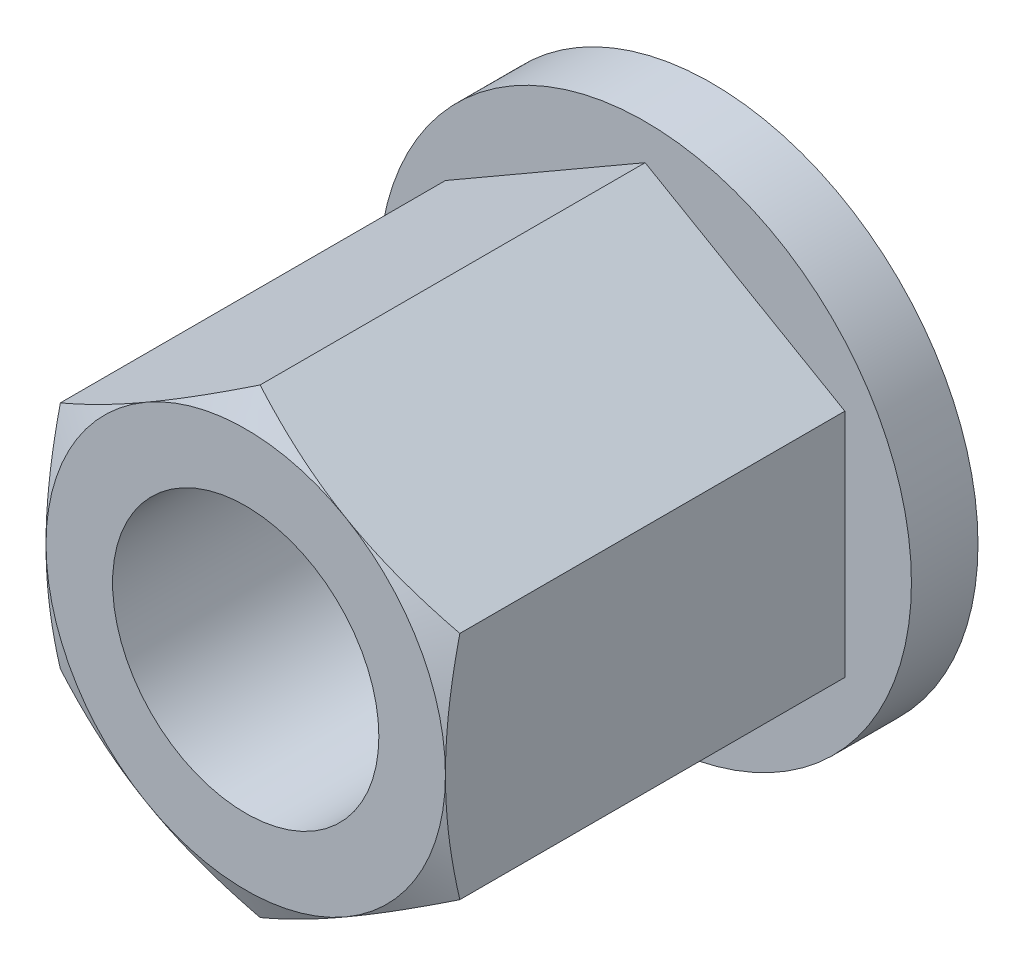
ISO-10303-21;
HEADER;
FILE_DESCRIPTION(('STEP AP214'),'2;1');
FILE_NAME('part.step','',(''),(''),'','','');
FILE_SCHEMA(('AUTOMOTIVE_DESIGN { 1 0 10303 214 1 1 1 1 }'));
ENDSEC;
DATA;
#1=APPLICATION_CONTEXT('core data for automotive mechanical design processes');
#2=APPLICATION_PROTOCOL_DEFINITION('international standard','automotive_design',2000,#1);
#3=PRODUCT_CONTEXT('',#1,'mechanical');
#4=PRODUCT('Part','Part','',(#3));
#5=PRODUCT_RELATED_PRODUCT_CATEGORY('part','',(#4));
#6=PRODUCT_DEFINITION_FORMATION('','',#4);
#7=PRODUCT_DEFINITION_CONTEXT('part definition',#1,'design');
#8=PRODUCT_DEFINITION('design','',#6,#7);
#9=PRODUCT_DEFINITION_SHAPE('','',#8);
#10=(LENGTH_UNIT() NAMED_UNIT(*) SI_UNIT(.MILLI.,.METRE.));
#11=(NAMED_UNIT(*) PLANE_ANGLE_UNIT() SI_UNIT($,.RADIAN.));
#12=(NAMED_UNIT(*) SI_UNIT($,.STERADIAN.) SOLID_ANGLE_UNIT());
#13=UNCERTAINTY_MEASURE_WITH_UNIT(LENGTH_MEASURE(1.E-05),#10,'distance_accuracy_value','');
#14=(GEOMETRIC_REPRESENTATION_CONTEXT(3) GLOBAL_UNCERTAINTY_ASSIGNED_CONTEXT((#13)) GLOBAL_UNIT_ASSIGNED_CONTEXT((#10,
#11,#12)) REPRESENTATION_CONTEXT('',''));
#15=CARTESIAN_POINT('',(0.,0.,0.));
#16=DIRECTION('',(0.,0.,1.));
#17=DIRECTION('',(1.,0.,0.));
#18=AXIS2_PLACEMENT_3D('',#15,#16,#17);
#19=CARTESIAN_POINT('',(0.,0.,34.5971502451229));
#20=DIRECTION('',(0.,0.,1.));
#21=DIRECTION('',(1.,0.,0.));
#22=AXIS2_PLACEMENT_3D('',#19,#20,#21);
#23=CYLINDRICAL_SURFACE('',#22,12.7);
#24=CARTESIAN_POINT('',(0.,0.,0.));
#25=DIRECTION('',(0.,0.,1.));
#26=DIRECTION('',(1.,0.,0.));
#27=AXIS2_PLACEMENT_3D('',#24,#25,#26);
#28=CIRCLE('',#27,12.7);
#29=CARTESIAN_POINT('',(12.7,0.,0.));
#30=VERTEX_POINT('',#29);
#31=EDGE_CURVE('E12',#30,#30,#28,.T.);
#32=ORIENTED_EDGE('',*,*,#31,.T.);
#33=EDGE_LOOP('',(#32));
#34=FACE_BOUND('',#33,.T.);
#35=CARTESIAN_POINT('',(0.,0.,3.175));
#36=DIRECTION('',(0.,0.,1.));
#37=DIRECTION('',(1.,0.,0.));
#38=AXIS2_PLACEMENT_3D('',#35,#36,#37);
#39=CIRCLE('',#38,12.7);
#40=CARTESIAN_POINT('',(12.7,0.,3.175));
#41=VERTEX_POINT('',#40);
#42=EDGE_CURVE('E39',#41,#41,#39,.T.);
#43=ORIENTED_EDGE('',*,*,#42,.F.);
#44=EDGE_LOOP('',(#43));
#45=FACE_BOUND('',#44,.T.);
#46=ADVANCED_FACE('F35',(#34,#45),#23,.T.);
#47=CARTESIAN_POINT('',(0.,0.,20.7444731853579));
#48=DIRECTION('',(0.,0.,-1.));
#49=DIRECTION('',(-1.,0.,0.));
#50=AXIS2_PLACEMENT_3D('',#47,#48,#49);
#51=CONICAL_SURFACE('',#50,12.7,1.13446401379632);
#52=CARTESIAN_POINT('',(-9.5252,-5.49914584397735,21.5378312686515));
#53=CARTESIAN_POINT('',(-9.23714774966446,-5.66545288824925,21.6153803198663));
#54=CARTESIAN_POINT('',(-8.94803264224347,-5.83237357334555,21.6879491868909));
#55=CARTESIAN_POINT('',(-8.36763285827653,-6.16746754485646,21.8213979318043));
#56=CARTESIAN_POINT('',(-8.07634709596202,-6.33564145813985,21.8822714859345));
#57=CARTESIAN_POINT('',(-7.49159935291989,-6.67324572499325,21.9905642276981));
#58=CARTESIAN_POINT('',(-7.19813558968586,-6.84267710769382,22.0379707623878));
#59=CARTESIAN_POINT('',(-6.6097036053371,-7.18240847225736,22.1175795674055));
#60=CARTESIAN_POINT('',(-6.31473567657497,-7.35270828533048,22.1497846863926));
#61=CARTESIAN_POINT('',(-5.72991174563497,-7.69035653928723,22.1972116585363));
#62=CARTESIAN_POINT('',(-5.44007656078522,-7.85769296128085,22.2127718014524));
#63=CARTESIAN_POINT('',(-4.8600719533166,-8.19255877753408,22.2274284110199));
#64=CARTESIAN_POINT('',(-4.56990251182178,-8.36008818269172,22.226523897209));
#65=CARTESIAN_POINT('',(-3.99022789296252,-8.69476347993251,22.2082967725173));
#66=CARTESIAN_POINT('',(-3.7007223485692,-8.86190958391988,22.1909894618081));
#67=CARTESIAN_POINT('',(-3.12276914422822,-9.19559102202515,22.1407018766246));
#68=CARTESIAN_POINT('',(-2.83432139045011,-9.36212641031609,22.1077230279152));
#69=CARTESIAN_POINT('',(-2.33329045725981,-9.65139675446584,22.0377395877518));
#70=CARTESIAN_POINT('',(-2.12035995791229,-9.77433223558281,22.0039761901903));
#71=CARTESIAN_POINT('',(-1.69547232667897,-10.0196412238507,21.9291583302494));
#72=CARTESIAN_POINT('',(-1.48351515466188,-10.1420147541715,21.8881041712953));
#73=CARTESIAN_POINT('',(-1.05893664165787,-10.3871452729464,21.7990179335116));
#74=CARTESIAN_POINT('',(-0.846323840389233,-10.5098973309921,21.7509319975265));
#75=CARTESIAN_POINT('',(-0.422222395200816,-10.7547524145353,21.6487315414084));
#76=CARTESIAN_POINT('',(-0.210733569249089,-10.8768555451291,21.5946180306942));
#77=CARTESIAN_POINT('',(0.000199999999999225,-10.9986380981162,21.5378312686515));
#78=B_SPLINE_CURVE_WITH_KNOTS('',3,(#52,#53,#54,#55,#56,#57,#58,#59,#60,#61,#62,#63,#64,#65,#66,
#67,#68,#69,#70,#71,#72,#73,#74,#75,#76,#77),.UNSPECIFIED.,.F.,.F.,(4,2,2,2,2,2,2,2,2,2,2,2,4),
(0.,1.02466245015782,2.04987739458362,3.07605241814589,4.10203506589353,5.10674474902197,
6.11151426231836,7.11534746997679,8.1190893683952,8.86351554085905,9.60791073919979,
10.3583390253194,11.1086418279986),.UNSPECIFIED.);
#79=CARTESIAN_POINT('',(-4.7625,-8.24889197104678,22.225));
#80=VERTEX_POINT('',#79);
#81=CARTESIAN_POINT('',(0.,-10.9985226280624,21.5378851140698));
#82=VERTEX_POINT('',#81);
#83=EDGE_CURVE('E115',#80,#82,#78,.T.);
#84=ORIENTED_EDGE('',*,*,#83,.T.);
#85=CARTESIAN_POINT('',(-0.000200000000001772,-10.9986380981162,21.5378312686515));
#86=CARTESIAN_POINT('',(0.287852250335537,-10.8323310538443,21.6153803198663));
#87=CARTESIAN_POINT('',(0.576967357756533,-10.665410368748,21.6879491868909));
#88=CARTESIAN_POINT('',(1.15736714172347,-10.3303163972371,21.8213979318043));
#89=CARTESIAN_POINT('',(1.44865290403798,-10.1621424839537,21.8822714859345));
#90=CARTESIAN_POINT('',(2.03340064708011,-9.82453821710031,21.990564227698));
#91=CARTESIAN_POINT('',(2.32686441031414,-9.65510683439974,22.0379707623878));
#92=CARTESIAN_POINT('',(2.9152963946629,-9.3153754698362,22.1175795674055));
#93=CARTESIAN_POINT('',(3.21026432342503,-9.14507565676308,22.1497846863926));
#94=CARTESIAN_POINT('',(3.79508825436503,-8.80742740280634,22.1972116585363));
#95=CARTESIAN_POINT('',(4.08492343921478,-8.64009098081271,22.2127718014524));
#96=CARTESIAN_POINT('',(4.6649280466834,-8.30522516455948,22.2274284110199));
#97=CARTESIAN_POINT('',(4.95509748817822,-8.13769575940184,22.226523897209));
#98=CARTESIAN_POINT('',(5.53477210703748,-7.80302046216105,22.2082967725173));
#99=CARTESIAN_POINT('',(5.8242776514308,-7.63587435817368,22.1909894618081));
#100=CARTESIAN_POINT('',(6.40223085577178,-7.30219292006841,22.1407018766246));
#101=CARTESIAN_POINT('',(6.69067860954989,-7.13565753177747,22.1077230279152));
#102=CARTESIAN_POINT('',(7.19170954274019,-6.84638718762772,22.0377395877518));
#103=CARTESIAN_POINT('',(7.40464004208771,-6.72345170651075,22.0039761901903));
#104=CARTESIAN_POINT('',(7.82952767332103,-6.47814271824285,21.9291583302494));
#105=CARTESIAN_POINT('',(8.04148484533813,-6.35576918792211,21.8881041712953));
#106=CARTESIAN_POINT('',(8.46606335834213,-6.11063866914712,21.7990179335116));
#107=CARTESIAN_POINT('',(8.67867615961077,-5.98788661110151,21.7509319975265));
#108=CARTESIAN_POINT('',(9.10277760479918,-5.74303152755827,21.6487315414084));
#109=CARTESIAN_POINT('',(9.31426643075091,-5.62092839696444,21.5946180306942));
#110=CARTESIAN_POINT('',(9.5252,-5.49914584397735,21.5378312686515));
#111=B_SPLINE_CURVE_WITH_KNOTS('',3,(#85,#86,#87,#88,#89,#90,#91,#92,#93,#94,#95,#96,#97,#98,
#99,#100,#101,#102,#103,#104,#105,#106,#107,#108,#109,#110),.UNSPECIFIED.,.F.,.F.,(4,2,2,2,2,2,
2,2,2,2,2,2,4),(0.,1.02466245015782,2.04987739458362,3.07605241814589,4.10203506589353,
5.10674474902197,6.11151426231836,7.11534746997679,8.1190893683952,8.86351554085905,
9.60791073919979,10.3583390253194,11.1086418279986),.UNSPECIFIED.);
#112=CARTESIAN_POINT('',(4.7625,-8.24889197104678,22.225));
#113=VERTEX_POINT('',#112);
#114=EDGE_CURVE('E241',#82,#113,#111,.T.);
#115=ORIENTED_EDGE('',*,*,#114,.T.);
#116=CARTESIAN_POINT('',(0.,0.,22.225));
#117=DIRECTION('',(0.,0.,1.));
#118=DIRECTION('',(1.,0.,0.));
#119=AXIS2_PLACEMENT_3D('',#116,#117,#118);
#120=CIRCLE('',#119,9.525);
#121=EDGE_CURVE('E254',#80,#113,#120,.T.);
#122=ORIENTED_EDGE('',*,*,#121,.F.);
#123=EDGE_LOOP('',(#84,#115,#122));
#124=FACE_BOUND('',#123,.T.);
#125=ADVANCED_FACE('F225',(#124),#51,.T.);
#126=CARTESIAN_POINT('',(9.525,0.,22.225));
#127=VERTEX_POINT('',#126);
#128=EDGE_CURVE('E248',#113,#127,#120,.T.);
#129=ORIENTED_EDGE('',*,*,#128,.F.);
#130=CARTESIAN_POINT('',(9.525,-5.49926131403119,21.5378851140698));
#131=VERTEX_POINT('',#130);
#132=EDGE_CURVE('E58',#113,#131,#111,.T.);
#133=ORIENTED_EDGE('',*,*,#132,.T.);
#134=CARTESIAN_POINT('',(9.525,-14.6714569370599,18.50983078932));
#135=CARTESIAN_POINT('',(9.525,-14.2424174047942,18.6775851744623));
#136=CARTESIAN_POINT('',(9.525,-13.8126576874129,18.8435313244609));
#137=CARTESIAN_POINT('',(9.525,-12.9513158035938,19.1707822644529));
#138=CARTESIAN_POINT('',(9.525,-12.5197334175996,19.3320864758727));
#139=CARTESIAN_POINT('',(9.525,-11.6530405020585,19.6495102046116));
#140=CARTESIAN_POINT('',(9.525,-11.2179230260299,19.8056108231762));
#141=CARTESIAN_POINT('',(9.525,-10.3451771820642,20.1106073489605));
#142=CARTESIAN_POINT('',(9.525,-9.90754890000271,20.2595035009666));
#143=CARTESIAN_POINT('',(9.525,-9.03504353010343,20.5463362866942));
#144=CARTESIAN_POINT('',(9.525,-8.6002054072028,20.6843908603759));
#145=CARTESIAN_POINT('',(9.525,-7.72709382701502,20.9493422722656));
#146=CARTESIAN_POINT('',(9.525,-7.28882019444548,21.076238537079));
#147=CARTESIAN_POINT('',(9.525,-6.4088121660482,21.3157940971686));
#148=CARTESIAN_POINT('',(9.525,-5.96708142698396,21.4284667165867));
#149=CARTESIAN_POINT('',(9.525,-5.07946799016646,21.636087566118));
#150=CARTESIAN_POINT('',(9.525,-4.6335858722676,21.7310382337242));
#151=CARTESIAN_POINT('',(9.525,-3.87954872279798,21.8724923478141));
#152=CARTESIAN_POINT('',(9.525,-3.57248614652507,21.9248164598931));
#153=CARTESIAN_POINT('',(9.525,-2.95660481466688,22.0179278182104));
#154=CARTESIAN_POINT('',(9.525,-2.6477861012117,22.0587153400327));
#155=CARTESIAN_POINT('',(9.525,-2.0288697566782,22.1275190998868));
#156=CARTESIAN_POINT('',(9.525,-1.71877283100044,22.1555416229303));
#157=CARTESIAN_POINT('',(9.525,-1.09763776975511,22.1979009742562));
#158=CARTESIAN_POINT('',(9.525,-0.786599642628748,22.2122379249154));
#159=CARTESIAN_POINT('',(9.525,-0.162860480611296,22.2267357500623));
#160=CARTESIAN_POINT('',(9.525,0.149841985278238,22.2268358530368));
#161=CARTESIAN_POINT('',(9.525,0.774923078901315,22.2127035909321));
#162=CARTESIAN_POINT('',(9.525,1.0873017019732,22.1984710223272));
#163=CARTESIAN_POINT('',(9.525,1.71116358202713,22.1561916124892));
#164=CARTESIAN_POINT('',(9.525,2.0226466870113,22.1281425510385));
#165=CARTESIAN_POINT('',(9.525,2.64415591419359,22.0591862306253));
#166=CARTESIAN_POINT('',(9.525,2.95418208861889,22.0182794362033));
#167=CARTESIAN_POINT('',(9.525,3.68793596874556,21.9073823711353));
#168=CARTESIAN_POINT('',(9.525,4.11088425686182,21.832235981874));
#169=CARTESIAN_POINT('',(9.525,4.95312622290305,21.6635043684355));
#170=CARTESIAN_POINT('',(9.525,5.37241899468547,21.5699147009707));
#171=CARTESIAN_POINT('',(9.525,6.20774491540377,21.3675897029298));
#172=CARTESIAN_POINT('',(9.525,6.62377437106444,21.2588392678876));
#173=CARTESIAN_POINT('',(9.525,7.4524145883651,21.0292107806886));
#174=CARTESIAN_POINT('',(9.525,7.86502557614724,20.9083335378054));
#175=CARTESIAN_POINT('',(9.525,8.68964656901352,20.6561267487627));
#176=CARTESIAN_POINT('',(9.525,9.10163913864557,20.5247405289047));
#177=CARTESIAN_POINT('',(9.525,9.92302025343939,20.2540865151779));
#178=CARTESIAN_POINT('',(9.525,10.3324087694497,20.1148186332487));
#179=CARTESIAN_POINT('',(9.525,11.1487520880277,19.8300105121744));
#180=CARTESIAN_POINT('',(9.525,11.5557080439795,19.6844735676852));
#181=CARTESIAN_POINT('',(9.525,12.3677362582521,19.3882573969582));
#182=CARTESIAN_POINT('',(9.525,12.772808528375,19.2375782029884));
#183=CARTESIAN_POINT('',(9.525,13.583159289861,18.9313355144351));
#184=CARTESIAN_POINT('',(9.525,13.9884306838863,18.7757532752347));
#185=CARTESIAN_POINT('',(9.525,14.7976127079132,18.4610859861206));
#186=CARTESIAN_POINT('',(9.525,15.2015233259534,18.3020009055089));
#187=CARTESIAN_POINT('',(9.525,16.4116322435901,17.8203700961145));
#188=CARTESIAN_POINT('',(9.525,17.2161052661535,17.4934878426219));
#189=CARTESIAN_POINT('',(9.525,18.4149318106988,16.9992500760519));
#190=CARTESIAN_POINT('',(9.525,18.8105664942429,16.8349801035234));
#191=CARTESIAN_POINT('',(9.525,19.6011211109873,16.5047254066563));
#192=CARTESIAN_POINT('',(9.525,19.9960410432742,16.3387406801283));
#193=CARTESIAN_POINT('',(9.525,20.7851711928324,16.0053444199197));
#194=CARTESIAN_POINT('',(9.525,21.1793815515204,15.8379332205521));
#195=CARTESIAN_POINT('',(9.525,21.9672568485612,15.5018384379186));
#196=CARTESIAN_POINT('',(9.525,22.3609217901359,15.3331548622072));
#197=CARTESIAN_POINT('',(9.525,22.7543533326489,15.1639300071672));
#198=B_SPLINE_CURVE_WITH_KNOTS('',3,(#134,#135,#136,#137,#138,#139,#140,#141,#142,#143,#144,
#145,#146,#147,#148,#149,#150,#151,#152,#153,#154,#155,#156,#157,#158,#159,#160,#161,#162,#163,
#164,#165,#166,#167,#168,#169,#170,#171,#172,#173,#174,#175,#176,#177,#178,#179,#180,#181,#182,
#183,#184,#185,#186,#187,#188,#189,#190,#191,#192,#193,#194,#195,#196,#197),.UNSPECIFIED.,.F.,
.F.,(4,2,2,2,2,2,2,2,2,2,2,2,2,2,2,2,2,2,2,2,2,2,2,2,2,2,2,2,2,2,2,4),(0.,1.38202297976087,
2.76421747596394,4.15098043688905,5.53769624660605,6.90626133303064,8.27489670518184,
9.64224032760618,11.0093957455571,11.9436756583985,12.8779332514394,13.8117303521963,
14.7455191028346,15.6832937119123,16.6210816376841,17.5590203088606,18.4969250968949,
19.7851181534977,21.0736219371275,22.3634187376715,23.6531295217593,24.9503372547595,
26.2475594840866,27.5441080933552,28.8406485681794,30.1429561981004,31.4452752456751,
34.0502419118193,35.3353873841365,36.620534497543,37.9053882788676,39.1902344376194),.UNSPECIFIED.);
#199=EDGE_CURVE('E113',#131,#127,#198,.T.);
#200=ORIENTED_EDGE('',*,*,#199,.T.);
#201=EDGE_LOOP('',(#129,#133,#200));
#202=FACE_BOUND('',#201,.T.);
#203=ADVANCED_FACE('F234',(#202),#51,.T.);
#204=CARTESIAN_POINT('',(4.7625,8.24889197104678,22.225));
#205=VERTEX_POINT('',#204);
#206=EDGE_CURVE('E44',#127,#205,#120,.T.);
#207=ORIENTED_EDGE('',*,*,#206,.F.);
#208=CARTESIAN_POINT('',(9.525,5.49926131403119,21.5378851140698));
#209=VERTEX_POINT('',#208);
#210=EDGE_CURVE('E197',#127,#209,#198,.T.);
#211=ORIENTED_EDGE('',*,*,#210,.T.);
#212=CARTESIAN_POINT('',(9.5252,5.49914584397736,21.5378312686515));
#213=CARTESIAN_POINT('',(9.23714774966446,5.66545288824926,21.6153803198663));
#214=CARTESIAN_POINT('',(8.94803264224347,5.83237357334555,21.6879491868909));
#215=CARTESIAN_POINT('',(8.36763285827653,6.16746754485647,21.8213979318043));
#216=CARTESIAN_POINT('',(8.07634709596202,6.33564145813985,21.8822714859345));
#217=CARTESIAN_POINT('',(7.49159935291989,6.67324572499325,21.990564227698));
#218=CARTESIAN_POINT('',(7.19813558968586,6.84267710769382,22.0379707623878));
#219=CARTESIAN_POINT('',(6.6097036053371,7.18240847225736,22.1175795674055));
#220=CARTESIAN_POINT('',(6.31473567657497,7.35270828533049,22.1497846863926));
#221=CARTESIAN_POINT('',(5.72991174563497,7.69035653928723,22.1972116585363));
#222=CARTESIAN_POINT('',(5.44007656078522,7.85769296128086,22.2127718014524));
#223=CARTESIAN_POINT('',(4.8600719533166,8.19255877753409,22.2274284110199));
#224=CARTESIAN_POINT('',(4.56990251182178,8.36008818269173,22.226523897209));
#225=CARTESIAN_POINT('',(3.99022789296252,8.69476347993251,22.2082967725173));
#226=CARTESIAN_POINT('',(3.7007223485692,8.86190958391989,22.1909894618081));
#227=CARTESIAN_POINT('',(3.12276914422822,9.19559102202516,22.1407018766246));
#228=CARTESIAN_POINT('',(2.83432139045011,9.36212641031609,22.1077230279152));
#229=CARTESIAN_POINT('',(2.33329045725981,9.65139675446584,22.0377395877518));
#230=CARTESIAN_POINT('',(2.12035995791229,9.77433223558281,22.0039761901903));
#231=CARTESIAN_POINT('',(1.69547232667897,10.0196412238507,21.9291583302494));
#232=CARTESIAN_POINT('',(1.48351515466188,10.1420147541715,21.8881041712953));
#233=CARTESIAN_POINT('',(1.05893664165787,10.3871452729464,21.7990179335116));
#234=CARTESIAN_POINT('',(0.846323840389236,10.5098973309921,21.7509319975264));
#235=CARTESIAN_POINT('',(0.422222395200818,10.7547524145353,21.6487315414084));
#236=CARTESIAN_POINT('',(0.210733569249092,10.8768555451291,21.5946180306942));
#237=CARTESIAN_POINT('',(-0.000199999999996797,10.9986380981162,21.5378312686515));
#238=B_SPLINE_CURVE_WITH_KNOTS('',3,(#212,#213,#214,#215,#216,#217,#218,#219,#220,#221,#222,
#223,#224,#225,#226,#227,#228,#229,#230,#231,#232,#233,#234,#235,#236,#237),.UNSPECIFIED.,.F.,
.F.,(4,2,2,2,2,2,2,2,2,2,2,2,4),(0.,1.02466245015782,2.04987739458362,3.07605241814588,
4.10203506589353,5.10674474902196,6.11151426231835,7.11534746997679,8.11908936839519,
8.86351554085905,9.60791073919979,10.3583390253194,11.1086418279986),.UNSPECIFIED.);
#239=EDGE_CURVE('E196',#209,#205,#238,.T.);
#240=ORIENTED_EDGE('',*,*,#239,.T.);
#241=EDGE_LOOP('',(#207,#211,#240));
#242=FACE_BOUND('',#241,.T.);
#243=ADVANCED_FACE('F258',(#242),#51,.T.);
#244=CARTESIAN_POINT('',(-4.7625,8.24889197104678,22.225));
#245=VERTEX_POINT('',#244);
#246=EDGE_CURVE('E260',#205,#245,#120,.T.);
#247=ORIENTED_EDGE('',*,*,#246,.F.);
#248=CARTESIAN_POINT('',(0.,10.9985226280624,21.5378851140698));
#249=VERTEX_POINT('',#248);
#250=EDGE_CURVE('E190',#205,#249,#238,.T.);
#251=ORIENTED_EDGE('',*,*,#250,.T.);
#252=CARTESIAN_POINT('',(0.000200000000002469,10.9986380981162,21.5378312686515));
#253=CARTESIAN_POINT('',(-0.287852250335537,10.8323310538443,21.6153803198663));
#254=CARTESIAN_POINT('',(-0.576967357756532,10.665410368748,21.6879491868909));
#255=CARTESIAN_POINT('',(-1.15736714172347,10.3303163972371,21.8213979318043));
#256=CARTESIAN_POINT('',(-1.44865290403798,10.1621424839537,21.8822714859345));
#257=CARTESIAN_POINT('',(-2.03340064708011,9.82453821710031,21.990564227698));
#258=CARTESIAN_POINT('',(-2.32686441031414,9.65510683439975,22.0379707623878));
#259=CARTESIAN_POINT('',(-2.9152963946629,9.31537546983621,22.1175795674055));
#260=CARTESIAN_POINT('',(-3.21026432342503,9.14507565676308,22.1497846863926));
#261=CARTESIAN_POINT('',(-3.79508825436503,8.80742740280634,22.1972116585363));
#262=CARTESIAN_POINT('',(-4.08492343921478,8.64009098081271,22.2127718014524));
#263=CARTESIAN_POINT('',(-4.6649280466834,8.30522516455948,22.2274284110199));
#264=CARTESIAN_POINT('',(-4.95509748817822,8.13769575940184,22.226523897209));
#265=CARTESIAN_POINT('',(-5.53477210703748,7.80302046216106,22.2082967725173));
#266=CARTESIAN_POINT('',(-5.8242776514308,7.63587435817368,22.1909894618081));
#267=CARTESIAN_POINT('',(-6.40223085577178,7.30219292006841,22.1407018766246));
#268=CARTESIAN_POINT('',(-6.69067860954989,7.13565753177748,22.1077230279152));
#269=CARTESIAN_POINT('',(-7.19170954274019,6.84638718762773,22.0377395877518));
#270=CARTESIAN_POINT('',(-7.40464004208771,6.72345170651075,22.0039761901903));
#271=CARTESIAN_POINT('',(-7.82952767332103,6.47814271824285,21.9291583302494));
#272=CARTESIAN_POINT('',(-8.04148484533813,6.35576918792211,21.8881041712953));
#273=CARTESIAN_POINT('',(-8.46606335834214,6.11063866914712,21.7990179335116));
#274=CARTESIAN_POINT('',(-8.67867615961077,5.98788661110151,21.7509319975265));
#275=CARTESIAN_POINT('',(-9.10277760479919,5.74303152755827,21.6487315414084));
#276=CARTESIAN_POINT('',(-9.31426643075092,5.62092839696444,21.5946180306942));
#277=CARTESIAN_POINT('',(-9.52520000000001,5.49914584397735,21.5378312686515));
#278=B_SPLINE_CURVE_WITH_KNOTS('',3,(#252,#253,#254,#255,#256,#257,#258,#259,#260,#261,#262,
#263,#264,#265,#266,#267,#268,#269,#270,#271,#272,#273,#274,#275,#276,#277),.UNSPECIFIED.,.F.,
.F.,(4,2,2,2,2,2,2,2,2,2,2,2,4),(0.,1.02466245015782,2.04987739458362,3.07605241814589,
4.10203506589353,5.10674474902196,6.11151426231835,7.11534746997679,8.1190893683952,
8.86351554085905,9.6079107391998,10.3583390253194,11.1086418279986),.UNSPECIFIED.);
#279=EDGE_CURVE('E188',#249,#245,#278,.T.);
#280=ORIENTED_EDGE('',*,*,#279,.T.);
#281=EDGE_LOOP('',(#247,#251,#280));
#282=FACE_BOUND('',#281,.T.);
#283=ADVANCED_FACE('F278',(#282),#51,.T.);
#284=CARTESIAN_POINT('',(-9.525,0.,22.225));
#285=VERTEX_POINT('',#284);
#286=EDGE_CURVE('E261',#245,#285,#120,.T.);
#287=ORIENTED_EDGE('',*,*,#286,.F.);
#288=CARTESIAN_POINT('',(-9.525,5.49926131403119,21.5378851140698));
#289=VERTEX_POINT('',#288);
#290=EDGE_CURVE('E182',#245,#289,#278,.T.);
#291=ORIENTED_EDGE('',*,*,#290,.T.);
#292=CARTESIAN_POINT('',(-9.525,-14.6714569370598,18.50983078932));
#293=CARTESIAN_POINT('',(-9.525,-14.2424174047942,18.6775851744623));
#294=CARTESIAN_POINT('',(-9.525,-13.8126576874129,18.8435313244609));
#295=CARTESIAN_POINT('',(-9.525,-12.9513158035938,19.1707822644529));
#296=CARTESIAN_POINT('',(-9.525,-12.5197334175996,19.3320864758727));
#297=CARTESIAN_POINT('',(-9.525,-11.6530405020585,19.6495102046116));
#298=CARTESIAN_POINT('',(-9.525,-11.2179230260299,19.8056108231762));
#299=CARTESIAN_POINT('',(-9.525,-10.3451771820642,20.1106073489605));
#300=CARTESIAN_POINT('',(-9.525,-9.9075489000027,20.2595035009666));
#301=CARTESIAN_POINT('',(-9.525,-9.03504353010342,20.5463362866942));
#302=CARTESIAN_POINT('',(-9.525,-8.60020540720279,20.6843908603759));
#303=CARTESIAN_POINT('',(-9.525,-7.72709382701501,20.9493422722657));
#304=CARTESIAN_POINT('',(-9.525,-7.28882019444547,21.076238537079));
#305=CARTESIAN_POINT('',(-9.525,-6.40881216604819,21.3157940971686));
#306=CARTESIAN_POINT('',(-9.525,-5.96708142698395,21.4284667165867));
#307=CARTESIAN_POINT('',(-9.525,-5.07946799016646,21.636087566118));
#308=CARTESIAN_POINT('',(-9.525,-4.63358587226759,21.7310382337242));
#309=CARTESIAN_POINT('',(-9.525,-3.87954872279797,21.8724923478141));
#310=CARTESIAN_POINT('',(-9.525,-3.57248614652506,21.9248164598931));
#311=CARTESIAN_POINT('',(-9.525,-2.95660481466688,22.0179278182104));
#312=CARTESIAN_POINT('',(-9.525,-2.6477861012117,22.0587153400327));
#313=CARTESIAN_POINT('',(-9.525,-2.02886975667819,22.1275190998868));
#314=CARTESIAN_POINT('',(-9.525,-1.71877283100043,22.1555416229303));
#315=CARTESIAN_POINT('',(-9.525,-1.09763776975511,22.1979009742562));
#316=CARTESIAN_POINT('',(-9.525,-0.786599642628742,22.2122379249154));
#317=CARTESIAN_POINT('',(-9.525,-0.162860480611291,22.2267357500623));
#318=CARTESIAN_POINT('',(-9.525,0.149841985278243,22.2268358530368));
#319=CARTESIAN_POINT('',(-9.525,0.774923078901321,22.2127035909321));
#320=CARTESIAN_POINT('',(-9.525,1.0873017019732,22.1984710223272));
#321=CARTESIAN_POINT('',(-9.525,1.71116358202714,22.1561916124892));
#322=CARTESIAN_POINT('',(-9.525,2.02264668701131,22.1281425510385));
#323=CARTESIAN_POINT('',(-9.525,2.6441559141936,22.0591862306253));
#324=CARTESIAN_POINT('',(-9.525,2.9541820886189,22.0182794362033));
#325=CARTESIAN_POINT('',(-9.525,3.68793596874557,21.9073823711353));
#326=CARTESIAN_POINT('',(-9.525,4.11088425686183,21.832235981874));
#327=CARTESIAN_POINT('',(-9.525,4.95312622290306,21.6635043684355));
#328=CARTESIAN_POINT('',(-9.525,5.37241899468549,21.5699147009707));
#329=CARTESIAN_POINT('',(-9.525,6.20774491540378,21.3675897029298));
#330=CARTESIAN_POINT('',(-9.525,6.62377437106445,21.2588392678876));
#331=CARTESIAN_POINT('',(-9.525,7.45241458836511,21.0292107806886));
#332=CARTESIAN_POINT('',(-9.525,7.86502557614726,20.9083335378054));
#333=CARTESIAN_POINT('',(-9.525,8.68964656901354,20.6561267487627));
#334=CARTESIAN_POINT('',(-9.525,9.10163913864559,20.5247405289047));
#335=CARTESIAN_POINT('',(-9.525,9.92302025343941,20.2540865151779));
#336=CARTESIAN_POINT('',(-9.525,10.3324087694497,20.1148186332487));
#337=CARTESIAN_POINT('',(-9.525,11.1487520880277,19.8300105121744));
#338=CARTESIAN_POINT('',(-9.525,11.5557080439795,19.6844735676852));
#339=CARTESIAN_POINT('',(-9.525,12.3677362582521,19.3882573969582));
#340=CARTESIAN_POINT('',(-9.525,12.772808528375,19.2375782029884));
#341=CARTESIAN_POINT('',(-9.525,13.583159289861,18.9313355144351));
#342=CARTESIAN_POINT('',(-9.525,13.9884306838864,18.7757532752347));
#343=CARTESIAN_POINT('',(-9.525,14.7976127079132,18.4610859861206));
#344=CARTESIAN_POINT('',(-9.525,15.2015233259534,18.3020009055089));
#345=CARTESIAN_POINT('',(-9.525,16.4116322435901,17.8203700961145));
#346=CARTESIAN_POINT('',(-9.525,17.2161052661535,17.4934878426219));
#347=CARTESIAN_POINT('',(-9.525,18.4149318106988,16.9992500760519));
#348=CARTESIAN_POINT('',(-9.525,18.8105664942429,16.8349801035234));
#349=CARTESIAN_POINT('',(-9.525,19.6011211109873,16.5047254066563));
#350=CARTESIAN_POINT('',(-9.525,19.9960410432742,16.3387406801283));
#351=CARTESIAN_POINT('',(-9.525,20.7851711928324,16.0053444199197));
#352=CARTESIAN_POINT('',(-9.525,21.1793815515204,15.8379332205521));
#353=CARTESIAN_POINT('',(-9.525,21.9672568485612,15.5018384379186));
#354=CARTESIAN_POINT('',(-9.525,22.3609217901359,15.3331548622072));
#355=CARTESIAN_POINT('',(-9.525,22.7543533326489,15.1639300071672));
#356=B_SPLINE_CURVE_WITH_KNOTS('',3,(#292,#293,#294,#295,#296,#297,#298,#299,#300,#301,#302,
#303,#304,#305,#306,#307,#308,#309,#310,#311,#312,#313,#314,#315,#316,#317,#318,#319,#320,#321,
#322,#323,#324,#325,#326,#327,#328,#329,#330,#331,#332,#333,#334,#335,#336,#337,#338,#339,#340,
#341,#342,#343,#344,#345,#346,#347,#348,#349,#350,#351,#352,#353,#354,#355),.UNSPECIFIED.,.F.,
.F.,(4,2,2,2,2,2,2,2,2,2,2,2,2,2,2,2,2,2,2,2,2,2,2,2,2,2,2,2,2,2,2,4),(0.,1.38202297976087,
2.76421747596394,4.15098043688905,5.53769624660606,6.90626133303064,8.27489670518184,
9.64224032760618,11.0093957455571,11.9436756583985,12.8779332514394,13.8117303521963,
14.7455191028346,15.6832937119123,16.6210816376841,17.5590203088606,18.4969250968949,
19.7851181534977,21.0736219371275,22.3634187376715,23.6531295217593,24.9503372547595,
26.2475594840866,27.5441080933552,28.8406485681794,30.1429561981004,31.4452752456751,
34.0502419118192,35.3353873841365,36.6205344975429,37.9053882788675,39.1902344376194),.UNSPECIFIED.);
#357=EDGE_CURVE('E189',#289,#285,#356,.F.);
#358=ORIENTED_EDGE('',*,*,#357,.T.);
#359=EDGE_LOOP('',(#287,#291,#358));
#360=FACE_BOUND('',#359,.T.);
#361=ADVANCED_FACE('F226',(#360),#51,.T.);
#362=CARTESIAN_POINT('',(0.,12.7,0.));
#363=DIRECTION('',(0.,0.,1.));
#364=DIRECTION('',(1.,0.,0.));
#365=AXIS2_PLACEMENT_3D('',#362,#363,#364);
#366=PLANE('',#365);
#367=ORIENTED_EDGE('',*,*,#31,.F.);
#368=EDGE_LOOP('',(#367));
#369=FACE_BOUND('',#368,.T.);
#370=CARTESIAN_POINT('',(0.,0.,0.));
#371=DIRECTION('',(0.,0.,1.));
#372=DIRECTION('',(1.,0.,0.));
#373=AXIS2_PLACEMENT_3D('',#370,#371,#372);
#374=CIRCLE('',#373,6.35);
#375=CARTESIAN_POINT('',(6.35,0.,0.));
#376=VERTEX_POINT('',#375);
#377=EDGE_CURVE('E240',#376,#376,#374,.T.);
#378=ORIENTED_EDGE('',*,*,#377,.T.);
#379=EDGE_LOOP('',(#378));
#380=FACE_BOUND('',#379,.T.);
#381=ADVANCED_FACE('F37',(#369,#380),#366,.F.);
#382=EDGE_CURVE('E266',#285,#80,#120,.T.);
#383=ORIENTED_EDGE('',*,*,#382,.F.);
#384=CARTESIAN_POINT('',(-9.525,-5.49926131403118,21.5378851140698));
#385=VERTEX_POINT('',#384);
#386=EDGE_CURVE('E157',#285,#385,#356,.F.);
#387=ORIENTED_EDGE('',*,*,#386,.T.);
#388=EDGE_CURVE('E156',#385,#80,#78,.T.);
#389=ORIENTED_EDGE('',*,*,#388,.T.);
#390=EDGE_LOOP('',(#383,#387,#389));
#391=FACE_BOUND('',#390,.T.);
#392=ADVANCED_FACE('F163',(#391),#51,.T.);
#393=CARTESIAN_POINT('',(0.,9.525,22.225));
#394=DIRECTION('',(0.,0.,-1.));
#395=DIRECTION('',(-1.,0.,0.));
#396=AXIS2_PLACEMENT_3D('',#393,#394,#395);
#397=PLANE('',#396);
#398=CARTESIAN_POINT('',(0.,0.,22.225));
#399=DIRECTION('',(0.,0.,1.));
#400=DIRECTION('',(1.,0.,0.));
#401=AXIS2_PLACEMENT_3D('',#398,#399,#400);
#402=CIRCLE('',#401,6.35);
#403=CARTESIAN_POINT('',(6.35,0.,22.225));
#404=VERTEX_POINT('',#403);
#405=EDGE_CURVE('E243',#404,#404,#402,.T.);
#406=ORIENTED_EDGE('',*,*,#405,.F.);
#407=EDGE_LOOP('',(#406));
#408=FACE_BOUND('',#407,.T.);
#409=ORIENTED_EDGE('',*,*,#206,.T.);
#410=ORIENTED_EDGE('',*,*,#246,.T.);
#411=ORIENTED_EDGE('',*,*,#286,.T.);
#412=ORIENTED_EDGE('',*,*,#382,.T.);
#413=ORIENTED_EDGE('',*,*,#121,.T.);
#414=ORIENTED_EDGE('',*,*,#128,.T.);
#415=EDGE_LOOP('',(#409,#410,#411,#412,#413,#414));
#416=FACE_BOUND('',#415,.T.);
#417=ADVANCED_FACE('F217',(#408,#416),#397,.F.);
#418=CARTESIAN_POINT('',(0.,0.,34.5971502451229));
#419=DIRECTION('',(0.,0.,1.));
#420=DIRECTION('',(1.,0.,0.));
#421=AXIS2_PLACEMENT_3D('',#418,#419,#420);
#422=CYLINDRICAL_SURFACE('',#421,6.35);
#423=ORIENTED_EDGE('',*,*,#377,.F.);
#424=EDGE_LOOP('',(#423));
#425=FACE_BOUND('',#424,.T.);
#426=ORIENTED_EDGE('',*,*,#405,.T.);
#427=EDGE_LOOP('',(#426));
#428=FACE_BOUND('',#427,.T.);
#429=ADVANCED_FACE('F215',(#425,#428),#422,.F.);
#430=CARTESIAN_POINT('',(0.,0.,3.175));
#431=DIRECTION('',(0.,0.,1.));
#432=DIRECTION('',(1.,0.,0.));
#433=AXIS2_PLACEMENT_3D('',#430,#431,#432);
#434=PLANE('',#433);
#435=DIRECTION('',(0.866025403784439,0.5,0.));
#436=VECTOR('',#435,1.);
#437=CARTESIAN_POINT('',(0.,-10.9985226280624,3.175));
#438=LINE('',#437,#436);
#439=CARTESIAN_POINT('',(0.,-10.9985226280624,3.175));
#440=VERTEX_POINT('',#439);
#441=CARTESIAN_POINT('',(9.525,-5.49926131403119,3.175));
#442=VERTEX_POINT('',#441);
#443=EDGE_CURVE('E124',#440,#442,#438,.T.);
#444=ORIENTED_EDGE('',*,*,#443,.F.);
#445=DIRECTION('',(0.866025403784438,-0.5,0.));
#446=VECTOR('',#445,1.);
#447=CARTESIAN_POINT('',(-9.525,-5.49926131403118,3.175));
#448=LINE('',#447,#446);
#449=CARTESIAN_POINT('',(-9.525,-5.49926131403118,3.175));
#450=VERTEX_POINT('',#449);
#451=EDGE_CURVE('E139',#450,#440,#448,.T.);
#452=ORIENTED_EDGE('',*,*,#451,.F.);
#453=DIRECTION('',(0.,-1.,0.));
#454=VECTOR('',#453,1.);
#455=CARTESIAN_POINT('',(-9.525,5.49926131403119,3.175));
#456=LINE('',#455,#454);
#457=CARTESIAN_POINT('',(-9.525,5.49926131403119,3.175));
#458=VERTEX_POINT('',#457);
#459=EDGE_CURVE('E136',#458,#450,#456,.T.);
#460=ORIENTED_EDGE('',*,*,#459,.F.);
#461=DIRECTION('',(-0.866025403784439,-0.5,0.));
#462=VECTOR('',#461,1.);
#463=CARTESIAN_POINT('',(0.,10.9985226280624,3.175));
#464=LINE('',#463,#462);
#465=CARTESIAN_POINT('',(0.,10.9985226280624,3.175));
#466=VERTEX_POINT('',#465);
#467=EDGE_CURVE('E133',#466,#458,#464,.T.);
#468=ORIENTED_EDGE('',*,*,#467,.F.);
#469=DIRECTION('',(-0.866025403784439,0.5,0.));
#470=VECTOR('',#469,1.);
#471=CARTESIAN_POINT('',(9.525,5.49926131403119,3.175));
#472=LINE('',#471,#470);
#473=CARTESIAN_POINT('',(9.525,5.49926131403119,3.175));
#474=VERTEX_POINT('',#473);
#475=EDGE_CURVE('E127',#474,#466,#472,.T.);
#476=ORIENTED_EDGE('',*,*,#475,.F.);
#477=DIRECTION('',(0.,1.,0.));
#478=VECTOR('',#477,1.);
#479=CARTESIAN_POINT('',(9.525,-5.49926131403119,3.175));
#480=LINE('',#479,#478);
#481=EDGE_CURVE('E111',#442,#474,#480,.T.);
#482=ORIENTED_EDGE('',*,*,#481,.F.);
#483=EDGE_LOOP('',(#444,#452,#460,#468,#476,#482));
#484=FACE_BOUND('',#483,.T.);
#485=ORIENTED_EDGE('',*,*,#42,.T.);
#486=EDGE_LOOP('',(#485));
#487=FACE_BOUND('',#486,.T.);
#488=ADVANCED_FACE('F121',(#484,#487),#434,.T.);
#489=CARTESIAN_POINT('',(0.,-10.9985226280624,22.225));
#490=DIRECTION('',(-0.5,0.866025403784439,0.));
#491=DIRECTION('',(-0.866025403784439,-0.5,0.));
#492=AXIS2_PLACEMENT_3D('',#489,#490,#491);
#493=PLANE('',#492);
#494=DIRECTION('',(0.,0.,-1.));
#495=VECTOR('',#494,1.);
#496=CARTESIAN_POINT('',(0.,-10.9985226280624,22.225));
#497=LINE('',#496,#495);
#498=EDGE_CURVE('E51',#82,#440,#497,.T.);
#499=ORIENTED_EDGE('',*,*,#498,.T.);
#500=ORIENTED_EDGE('',*,*,#443,.T.);
#501=DIRECTION('',(0.,0.,-1.));
#502=VECTOR('',#501,1.);
#503=CARTESIAN_POINT('',(9.525,-5.49926131403119,22.225));
#504=LINE('',#503,#502);
#505=EDGE_CURVE('E107',#131,#442,#504,.T.);
#506=ORIENTED_EDGE('',*,*,#505,.F.);
#507=ORIENTED_EDGE('',*,*,#132,.F.);
#508=ORIENTED_EDGE('',*,*,#114,.F.);
#509=EDGE_LOOP('',(#499,#500,#506,#507,#508));
#510=FACE_BOUND('',#509,.T.);
#511=ADVANCED_FACE('F129',(#510),#493,.F.);
#512=CARTESIAN_POINT('',(9.525,-5.49926131403119,22.225));
#513=DIRECTION('',(-1.,0.,0.));
#514=DIRECTION('',(0.,-1.,0.));
#515=AXIS2_PLACEMENT_3D('',#512,#513,#514);
#516=PLANE('',#515);
#517=ORIENTED_EDGE('',*,*,#505,.T.);
#518=ORIENTED_EDGE('',*,*,#481,.T.);
#519=DIRECTION('',(0.,0.,-1.));
#520=VECTOR('',#519,1.);
#521=CARTESIAN_POINT('',(9.525,5.49926131403119,22.225));
#522=LINE('',#521,#520);
#523=EDGE_CURVE('E116',#209,#474,#522,.T.);
#524=ORIENTED_EDGE('',*,*,#523,.F.);
#525=ORIENTED_EDGE('',*,*,#210,.F.);
#526=ORIENTED_EDGE('',*,*,#199,.F.);
#527=EDGE_LOOP('',(#517,#518,#524,#525,#526));
#528=FACE_BOUND('',#527,.T.);
#529=ADVANCED_FACE('F109',(#528),#516,.F.);
#530=CARTESIAN_POINT('',(9.525,5.49926131403119,22.225));
#531=DIRECTION('',(-0.5,-0.866025403784439,0.));
#532=DIRECTION('',(0.866025403784439,-0.5,0.));
#533=AXIS2_PLACEMENT_3D('',#530,#531,#532);
#534=PLANE('',#533);
#535=ORIENTED_EDGE('',*,*,#523,.T.);
#536=ORIENTED_EDGE('',*,*,#475,.T.);
#537=DIRECTION('',(0.,0.,-1.));
#538=VECTOR('',#537,1.);
#539=CARTESIAN_POINT('',(0.,10.9985226280624,22.225));
#540=LINE('',#539,#538);
#541=EDGE_CURVE('E146',#249,#466,#540,.T.);
#542=ORIENTED_EDGE('',*,*,#541,.F.);
#543=ORIENTED_EDGE('',*,*,#250,.F.);
#544=ORIENTED_EDGE('',*,*,#239,.F.);
#545=EDGE_LOOP('',(#535,#536,#542,#543,#544));
#546=FACE_BOUND('',#545,.T.);
#547=ADVANCED_FACE('F178',(#546),#534,.F.);
#548=CARTESIAN_POINT('',(0.,10.9985226280624,22.225));
#549=DIRECTION('',(0.5,-0.866025403784439,0.));
#550=DIRECTION('',(0.866025403784439,0.5,0.));
#551=AXIS2_PLACEMENT_3D('',#548,#549,#550);
#552=PLANE('',#551);
#553=ORIENTED_EDGE('',*,*,#541,.T.);
#554=ORIENTED_EDGE('',*,*,#467,.T.);
#555=DIRECTION('',(0.,0.,-1.));
#556=VECTOR('',#555,1.);
#557=CARTESIAN_POINT('',(-9.525,5.49926131403119,22.225));
#558=LINE('',#557,#556);
#559=EDGE_CURVE('E144',#289,#458,#558,.T.);
#560=ORIENTED_EDGE('',*,*,#559,.F.);
#561=ORIENTED_EDGE('',*,*,#290,.F.);
#562=ORIENTED_EDGE('',*,*,#279,.F.);
#563=EDGE_LOOP('',(#553,#554,#560,#561,#562));
#564=FACE_BOUND('',#563,.T.);
#565=ADVANCED_FACE('F173',(#564),#552,.F.);
#566=CARTESIAN_POINT('',(-9.525,5.49926131403119,22.225));
#567=DIRECTION('',(1.,0.,0.));
#568=DIRECTION('',(0.,0.,-1.));
#569=AXIS2_PLACEMENT_3D('',#566,#567,#568);
#570=PLANE('',#569);
#571=ORIENTED_EDGE('',*,*,#559,.T.);
#572=ORIENTED_EDGE('',*,*,#459,.T.);
#573=DIRECTION('',(0.,0.,-1.));
#574=VECTOR('',#573,1.);
#575=CARTESIAN_POINT('',(-9.525,-5.49926131403118,22.225));
#576=LINE('',#575,#574);
#577=EDGE_CURVE('E142',#385,#450,#576,.T.);
#578=ORIENTED_EDGE('',*,*,#577,.F.);
#579=ORIENTED_EDGE('',*,*,#386,.F.);
#580=ORIENTED_EDGE('',*,*,#357,.F.);
#581=EDGE_LOOP('',(#571,#572,#578,#579,#580));
#582=FACE_BOUND('',#581,.T.);
#583=ADVANCED_FACE('F169',(#582),#570,.F.);
#584=CARTESIAN_POINT('',(-9.525,-5.49926131403118,22.225));
#585=DIRECTION('',(0.5,0.866025403784438,0.));
#586=DIRECTION('',(-0.866025403784439,0.5,0.));
#587=AXIS2_PLACEMENT_3D('',#584,#585,#586);
#588=PLANE('',#587);
#589=ORIENTED_EDGE('',*,*,#577,.T.);
#590=ORIENTED_EDGE('',*,*,#451,.T.);
#591=ORIENTED_EDGE('',*,*,#498,.F.);
#592=ORIENTED_EDGE('',*,*,#83,.F.);
#593=ORIENTED_EDGE('',*,*,#388,.F.);
#594=EDGE_LOOP('',(#589,#590,#591,#592,#593));
#595=FACE_BOUND('',#594,.T.);
#596=ADVANCED_FACE('F166',(#595),#588,.F.);
#597=CLOSED_SHELL('',(#46,#125,#203,#243,#283,#361,#381,#392,#417,#429,#488,#511,#529,#547,#565,
#583,#596));
#598=MANIFOLD_SOLID_BREP('B2',#597);
#599=ADVANCED_BREP_SHAPE_REPRESENTATION('',(#18,#598),#14);
#600=SHAPE_DEFINITION_REPRESENTATION(#9,#599);
ENDSEC;
END-ISO-10303-21;
